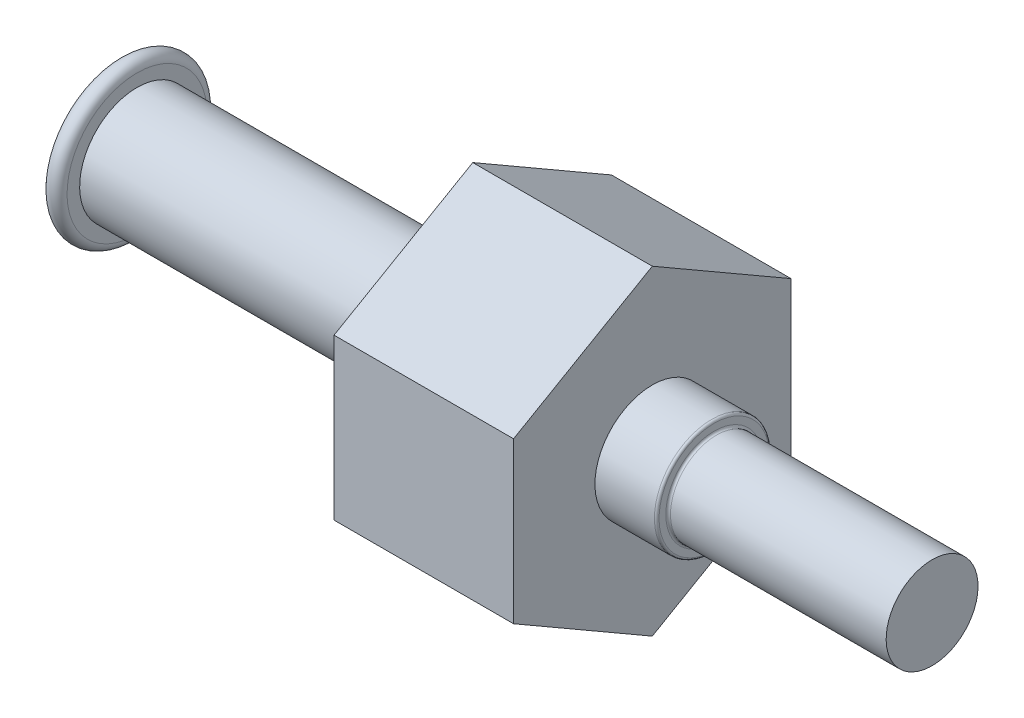
ISO-10303-21;
HEADER;
FILE_DESCRIPTION(('STEP AP214'),'2;1');
FILE_NAME('part.step','',(''),(''),'','','');
FILE_SCHEMA(('AUTOMOTIVE_DESIGN { 1 0 10303 214 1 1 1 1 }'));
ENDSEC;
DATA;
#1=APPLICATION_CONTEXT('core data for automotive mechanical design processes');
#2=APPLICATION_PROTOCOL_DEFINITION('international standard','automotive_design',2000,#1);
#3=PRODUCT_CONTEXT('',#1,'mechanical');
#4=PRODUCT('Part','Part','',(#3));
#5=PRODUCT_RELATED_PRODUCT_CATEGORY('part','',(#4));
#6=PRODUCT_DEFINITION_FORMATION('','',#4);
#7=PRODUCT_DEFINITION_CONTEXT('part definition',#1,'design');
#8=PRODUCT_DEFINITION('design','',#6,#7);
#9=PRODUCT_DEFINITION_SHAPE('','',#8);
#10=(LENGTH_UNIT() NAMED_UNIT(*) SI_UNIT(.MILLI.,.METRE.));
#11=(NAMED_UNIT(*) PLANE_ANGLE_UNIT() SI_UNIT($,.RADIAN.));
#12=(NAMED_UNIT(*) SI_UNIT($,.STERADIAN.) SOLID_ANGLE_UNIT());
#13=UNCERTAINTY_MEASURE_WITH_UNIT(LENGTH_MEASURE(1.E-05),#10,'distance_accuracy_value','');
#14=(GEOMETRIC_REPRESENTATION_CONTEXT(3) GLOBAL_UNCERTAINTY_ASSIGNED_CONTEXT((#13)) GLOBAL_UNIT_ASSIGNED_CONTEXT((#10,
#11,#12)) REPRESENTATION_CONTEXT('',''));
#15=CARTESIAN_POINT('',(0.,0.,0.));
#16=DIRECTION('',(0.,0.,1.));
#17=DIRECTION('',(1.,0.,0.));
#18=AXIS2_PLACEMENT_3D('',#15,#16,#17);
#19=CARTESIAN_POINT('',(34.1,0.,0.));
#20=DIRECTION('',(1.,0.,0.));
#21=DIRECTION('',(0.,1.,0.));
#22=AXIS2_PLACEMENT_3D('',#19,#20,#21);
#23=CYLINDRICAL_SURFACE('',#22,2.46);
#24=CARTESIAN_POINT('',(22.1,0.,0.));
#25=DIRECTION('',(1.,0.,0.));
#26=DIRECTION('',(0.,0.,-1.));
#27=AXIS2_PLACEMENT_3D('',#24,#25,#26);
#28=CIRCLE('',#27,2.46);
#29=CARTESIAN_POINT('',(22.1,0.,-2.46));
#30=VERTEX_POINT('',#29);
#31=EDGE_CURVE('E11',#30,#30,#28,.F.);
#32=ORIENTED_EDGE('',*,*,#31,.F.);
#33=EDGE_LOOP('',(#32));
#34=FACE_BOUND('',#33,.T.);
#35=CARTESIAN_POINT('',(24.65,0.,0.));
#36=DIRECTION('',(1.,0.,0.));
#37=DIRECTION('',(0.,1.,0.));
#38=AXIS2_PLACEMENT_3D('',#35,#36,#37);
#39=CIRCLE('',#38,2.46);
#40=CARTESIAN_POINT('',(24.65,2.46,0.));
#41=VERTEX_POINT('',#40);
#42=EDGE_CURVE('E49',#41,#41,#39,.T.);
#43=ORIENTED_EDGE('',*,*,#42,.F.);
#44=EDGE_LOOP('',(#43));
#45=FACE_BOUND('',#44,.T.);
#46=ADVANCED_FACE('F39',(#34,#45),#23,.T.);
#47=CARTESIAN_POINT('',(24.65,0.,0.));
#48=DIRECTION('',(1.,0.,0.));
#49=DIRECTION('',(0.,1.,0.));
#50=AXIS2_PLACEMENT_3D('',#47,#48,#49);
#51=TOROIDAL_SURFACE('',#50,2.36,0.0999999999999996);
#52=ORIENTED_EDGE('',*,*,#42,.T.);
#53=EDGE_LOOP('',(#52));
#54=FACE_BOUND('',#53,.T.);
#55=CARTESIAN_POINT('',(24.75,0.,0.));
#56=DIRECTION('',(1.,0.,0.));
#57=DIRECTION('',(0.,1.,0.));
#58=AXIS2_PLACEMENT_3D('',#55,#56,#57);
#59=CIRCLE('',#58,2.36);
#60=CARTESIAN_POINT('',(24.75,2.36,0.));
#61=VERTEX_POINT('',#60);
#62=EDGE_CURVE('E190',#61,#61,#59,.T.);
#63=ORIENTED_EDGE('',*,*,#62,.F.);
#64=EDGE_LOOP('',(#63));
#65=FACE_BOUND('',#64,.T.);
#66=ADVANCED_FACE('F198',(#54,#65),#51,.T.);
#67=CARTESIAN_POINT('',(24.75,2.36,0.));
#68=DIRECTION('',(1.,0.,0.));
#69=DIRECTION('',(0.,1.,0.));
#70=AXIS2_PLACEMENT_3D('',#67,#68,#69);
#71=PLANE('',#70);
#72=ORIENTED_EDGE('',*,*,#62,.T.);
#73=EDGE_LOOP('',(#72));
#74=FACE_BOUND('',#73,.T.);
#75=CARTESIAN_POINT('',(24.75,0.,0.));
#76=DIRECTION('',(1.,0.,0.));
#77=DIRECTION('',(0.,1.,0.));
#78=AXIS2_PLACEMENT_3D('',#75,#76,#77);
#79=CIRCLE('',#78,2.07);
#80=CARTESIAN_POINT('',(24.75,2.07,0.));
#81=VERTEX_POINT('',#80);
#82=EDGE_CURVE('E186',#81,#81,#79,.T.);
#83=ORIENTED_EDGE('',*,*,#82,.F.);
#84=EDGE_LOOP('',(#83));
#85=FACE_BOUND('',#84,.T.);
#86=ADVANCED_FACE('F207',(#74,#85),#71,.T.);
#87=CARTESIAN_POINT('',(24.85,0.,0.));
#88=DIRECTION('',(1.,0.,0.));
#89=DIRECTION('',(0.,1.,0.));
#90=AXIS2_PLACEMENT_3D('',#87,#88,#89);
#91=TOROIDAL_SURFACE('',#90,2.07,0.0999999999999996);
#92=ORIENTED_EDGE('',*,*,#82,.T.);
#93=EDGE_LOOP('',(#92));
#94=FACE_BOUND('',#93,.T.);
#95=CARTESIAN_POINT('',(24.85,0.,0.));
#96=DIRECTION('',(1.,0.,0.));
#97=DIRECTION('',(0.,1.,0.));
#98=AXIS2_PLACEMENT_3D('',#95,#96,#97);
#99=CIRCLE('',#98,1.97);
#100=CARTESIAN_POINT('',(24.85,1.97,0.));
#101=VERTEX_POINT('',#100);
#102=EDGE_CURVE('E182',#101,#101,#99,.T.);
#103=ORIENTED_EDGE('',*,*,#102,.F.);
#104=EDGE_LOOP('',(#103));
#105=FACE_BOUND('',#104,.T.);
#106=ADVANCED_FACE('F264',(#94,#105),#91,.F.);
#107=CARTESIAN_POINT('',(34.1,0.,0.));
#108=DIRECTION('',(1.,0.,0.));
#109=DIRECTION('',(0.,1.,0.));
#110=AXIS2_PLACEMENT_3D('',#107,#108,#109);
#111=CYLINDRICAL_SURFACE('',#110,1.97);
#112=ORIENTED_EDGE('',*,*,#102,.T.);
#113=EDGE_LOOP('',(#112));
#114=FACE_BOUND('',#113,.T.);
#115=CARTESIAN_POINT('',(34.1,0.,0.));
#116=DIRECTION('',(1.,0.,0.));
#117=DIRECTION('',(0.,1.,0.));
#118=AXIS2_PLACEMENT_3D('',#115,#116,#117);
#119=CIRCLE('',#118,1.97);
#120=CARTESIAN_POINT('',(34.1,1.97,0.));
#121=VERTEX_POINT('',#120);
#122=EDGE_CURVE('E178',#121,#121,#119,.T.);
#123=ORIENTED_EDGE('',*,*,#122,.F.);
#124=EDGE_LOOP('',(#123));
#125=FACE_BOUND('',#124,.T.);
#126=ADVANCED_FACE('F260',(#114,#125),#111,.T.);
#127=CARTESIAN_POINT('',(34.1,1.97,0.));
#128=DIRECTION('',(1.,0.,0.));
#129=DIRECTION('',(0.,1.,0.));
#130=AXIS2_PLACEMENT_3D('',#127,#128,#129);
#131=PLANE('',#130);
#132=ORIENTED_EDGE('',*,*,#122,.T.);
#133=EDGE_LOOP('',(#132));
#134=FACE_BOUND('',#133,.T.);
#135=ADVANCED_FACE('F250',(#134),#131,.T.);
#136=CARTESIAN_POINT('',(14.4,6.87046820335655,0.));
#137=DIRECTION('',(0.,0.866025403784439,0.5));
#138=DIRECTION('',(0.,-0.5,0.866025403784439));
#139=AXIS2_PLACEMENT_3D('',#136,#137,#138);
#140=PLANE('',#139);
#141=DIRECTION('',(0.,-0.5,0.866025403784438));
#142=VECTOR('',#141,1.);
#143=CARTESIAN_POINT('',(22.1,6.87046820335655,0.));
#144=LINE('',#143,#142);
#145=CARTESIAN_POINT('',(22.1,6.87046820335655,0.));
#146=VERTEX_POINT('',#145);
#147=CARTESIAN_POINT('',(22.1,3.43523410167827,5.95));
#148=VERTEX_POINT('',#147);
#149=EDGE_CURVE('E133',#146,#148,#144,.T.);
#150=ORIENTED_EDGE('',*,*,#149,.F.);
#151=DIRECTION('',(1.,0.,0.));
#152=VECTOR('',#151,1.);
#153=CARTESIAN_POINT('',(14.4,6.87046820335655,0.));
#154=LINE('',#153,#152);
#155=CARTESIAN_POINT('',(14.4,6.87046820335655,0.));
#156=VERTEX_POINT('',#155);
#157=EDGE_CURVE('E57',#156,#146,#154,.T.);
#158=ORIENTED_EDGE('',*,*,#157,.F.);
#159=DIRECTION('',(0.,-0.5,0.866025403784438));
#160=VECTOR('',#159,1.);
#161=CARTESIAN_POINT('',(14.4,6.87046820335655,0.));
#162=LINE('',#161,#160);
#163=CARTESIAN_POINT('',(14.4,3.43523410167827,5.95));
#164=VERTEX_POINT('',#163);
#165=EDGE_CURVE('E154',#156,#164,#162,.T.);
#166=ORIENTED_EDGE('',*,*,#165,.T.);
#167=DIRECTION('',(1.,0.,0.));
#168=VECTOR('',#167,1.);
#169=CARTESIAN_POINT('',(14.4,3.43523410167827,5.95));
#170=LINE('',#169,#168);
#171=EDGE_CURVE('E92',#164,#148,#170,.T.);
#172=ORIENTED_EDGE('',*,*,#171,.T.);
#173=EDGE_LOOP('',(#150,#158,#166,#172));
#174=FACE_BOUND('',#173,.T.);
#175=ADVANCED_FACE('F241',(#174),#140,.T.);
#176=CARTESIAN_POINT('',(14.4,3.43523410167827,-5.95));
#177=DIRECTION('',(0.,0.866025403784438,-0.5));
#178=DIRECTION('',(0.,0.5,0.866025403784439));
#179=AXIS2_PLACEMENT_3D('',#176,#177,#178);
#180=PLANE('',#179);
#181=DIRECTION('',(0.,0.5,0.866025403784438));
#182=VECTOR('',#181,1.);
#183=CARTESIAN_POINT('',(22.1,3.43523410167827,-5.95));
#184=LINE('',#183,#182);
#185=CARTESIAN_POINT('',(22.1,3.43523410167827,-5.95));
#186=VERTEX_POINT('',#185);
#187=EDGE_CURVE('E150',#186,#146,#184,.T.);
#188=ORIENTED_EDGE('',*,*,#187,.F.);
#189=DIRECTION('',(1.,0.,0.));
#190=VECTOR('',#189,1.);
#191=CARTESIAN_POINT('',(14.4,3.43523410167827,-5.95));
#192=LINE('',#191,#190);
#193=CARTESIAN_POINT('',(14.4,3.43523410167827,-5.95));
#194=VERTEX_POINT('',#193);
#195=EDGE_CURVE('E80',#194,#186,#192,.T.);
#196=ORIENTED_EDGE('',*,*,#195,.F.);
#197=DIRECTION('',(0.,0.5,0.866025403784438));
#198=VECTOR('',#197,1.);
#199=CARTESIAN_POINT('',(14.4,3.43523410167827,-5.95));
#200=LINE('',#199,#198);
#201=EDGE_CURVE('E119',#194,#156,#200,.T.);
#202=ORIENTED_EDGE('',*,*,#201,.T.);
#203=ORIENTED_EDGE('',*,*,#157,.T.);
#204=EDGE_LOOP('',(#188,#196,#202,#203));
#205=FACE_BOUND('',#204,.T.);
#206=ADVANCED_FACE('F238',(#205),#180,.T.);
#207=CARTESIAN_POINT('',(14.4,-3.43523410167827,-5.95));
#208=DIRECTION('',(0.,0.,-1.));
#209=DIRECTION('',(0.,1.,0.));
#210=AXIS2_PLACEMENT_3D('',#207,#208,#209);
#211=PLANE('',#210);
#212=DIRECTION('',(0.,1.,0.));
#213=VECTOR('',#212,1.);
#214=CARTESIAN_POINT('',(22.1,-3.43523410167827,-5.95));
#215=LINE('',#214,#213);
#216=CARTESIAN_POINT('',(22.1,-3.43523410167827,-5.95));
#217=VERTEX_POINT('',#216);
#218=EDGE_CURVE('E105',#217,#186,#215,.T.);
#219=ORIENTED_EDGE('',*,*,#218,.F.);
#220=DIRECTION('',(1.,0.,0.));
#221=VECTOR('',#220,1.);
#222=CARTESIAN_POINT('',(14.4,-3.43523410167827,-5.95));
#223=LINE('',#222,#221);
#224=CARTESIAN_POINT('',(14.4,-3.43523410167827,-5.95));
#225=VERTEX_POINT('',#224);
#226=EDGE_CURVE('E100',#225,#217,#223,.T.);
#227=ORIENTED_EDGE('',*,*,#226,.F.);
#228=DIRECTION('',(0.,1.,0.));
#229=VECTOR('',#228,1.);
#230=CARTESIAN_POINT('',(14.4,-3.43523410167827,-5.95));
#231=LINE('',#230,#229);
#232=EDGE_CURVE('E103',#225,#194,#231,.T.);
#233=ORIENTED_EDGE('',*,*,#232,.T.);
#234=ORIENTED_EDGE('',*,*,#195,.T.);
#235=EDGE_LOOP('',(#219,#227,#233,#234));
#236=FACE_BOUND('',#235,.T.);
#237=ADVANCED_FACE('F102',(#236),#211,.T.);
#238=CARTESIAN_POINT('',(14.4,-6.87046820335655,0.));
#239=DIRECTION('',(0.,-0.866025403784438,-0.5));
#240=DIRECTION('',(0.,0.5,-0.866025403784439));
#241=AXIS2_PLACEMENT_3D('',#238,#239,#240);
#242=PLANE('',#241);
#243=DIRECTION('',(0.,0.5,-0.866025403784438));
#244=VECTOR('',#243,1.);
#245=CARTESIAN_POINT('',(22.1,-6.87046820335655,0.));
#246=LINE('',#245,#244);
#247=CARTESIAN_POINT('',(22.1,-6.87046820335655,0.));
#248=VERTEX_POINT('',#247);
#249=EDGE_CURVE('E145',#248,#217,#246,.T.);
#250=ORIENTED_EDGE('',*,*,#249,.F.);
#251=DIRECTION('',(1.,0.,0.));
#252=VECTOR('',#251,1.);
#253=CARTESIAN_POINT('',(14.4,-6.87046820335655,0.));
#254=LINE('',#253,#252);
#255=CARTESIAN_POINT('',(14.4,-6.87046820335655,0.));
#256=VERTEX_POINT('',#255);
#257=EDGE_CURVE('E111',#256,#248,#254,.T.);
#258=ORIENTED_EDGE('',*,*,#257,.F.);
#259=DIRECTION('',(0.,0.5,-0.866025403784438));
#260=VECTOR('',#259,1.);
#261=CARTESIAN_POINT('',(14.4,-6.87046820335655,0.));
#262=LINE('',#261,#260);
#263=EDGE_CURVE('E117',#256,#225,#262,.T.);
#264=ORIENTED_EDGE('',*,*,#263,.T.);
#265=ORIENTED_EDGE('',*,*,#226,.T.);
#266=EDGE_LOOP('',(#250,#258,#264,#265));
#267=FACE_BOUND('',#266,.T.);
#268=ADVANCED_FACE('F122',(#267),#242,.T.);
#269=CARTESIAN_POINT('',(14.4,-3.43523410167827,5.95));
#270=DIRECTION('',(0.,-0.866025403784438,0.5));
#271=DIRECTION('',(0.,-0.5,-0.866025403784439));
#272=AXIS2_PLACEMENT_3D('',#269,#270,#271);
#273=PLANE('',#272);
#274=DIRECTION('',(0.,-0.5,-0.866025403784438));
#275=VECTOR('',#274,1.);
#276=CARTESIAN_POINT('',(22.1,-3.43523410167827,5.95));
#277=LINE('',#276,#275);
#278=CARTESIAN_POINT('',(22.1,-3.43523410167827,5.95));
#279=VERTEX_POINT('',#278);
#280=EDGE_CURVE('E141',#279,#248,#277,.T.);
#281=ORIENTED_EDGE('',*,*,#280,.F.);
#282=DIRECTION('',(1.,0.,0.));
#283=VECTOR('',#282,1.);
#284=CARTESIAN_POINT('',(14.4,-3.43523410167827,5.95));
#285=LINE('',#284,#283);
#286=CARTESIAN_POINT('',(14.4,-3.43523410167827,5.95));
#287=VERTEX_POINT('',#286);
#288=EDGE_CURVE('E161',#287,#279,#285,.T.);
#289=ORIENTED_EDGE('',*,*,#288,.F.);
#290=DIRECTION('',(0.,-0.5,-0.866025403784438));
#291=VECTOR('',#290,1.);
#292=CARTESIAN_POINT('',(14.4,-3.43523410167827,5.95));
#293=LINE('',#292,#291);
#294=EDGE_CURVE('E124',#287,#256,#293,.T.);
#295=ORIENTED_EDGE('',*,*,#294,.T.);
#296=ORIENTED_EDGE('',*,*,#257,.T.);
#297=EDGE_LOOP('',(#281,#289,#295,#296));
#298=FACE_BOUND('',#297,.T.);
#299=ADVANCED_FACE('F235',(#298),#273,.T.);
#300=CARTESIAN_POINT('',(14.4,3.43523410167827,5.95));
#301=DIRECTION('',(0.,0.,1.));
#302=DIRECTION('',(0.,-1.,0.));
#303=AXIS2_PLACEMENT_3D('',#300,#301,#302);
#304=PLANE('',#303);
#305=DIRECTION('',(0.,-1.,0.));
#306=VECTOR('',#305,1.);
#307=CARTESIAN_POINT('',(22.1,3.43523410167827,5.95));
#308=LINE('',#307,#306);
#309=EDGE_CURVE('E137',#148,#279,#308,.T.);
#310=ORIENTED_EDGE('',*,*,#309,.F.);
#311=ORIENTED_EDGE('',*,*,#171,.F.);
#312=DIRECTION('',(0.,-1.,0.));
#313=VECTOR('',#312,1.);
#314=CARTESIAN_POINT('',(14.4,3.43523410167827,5.95));
#315=LINE('',#314,#313);
#316=EDGE_CURVE('E127',#164,#287,#315,.T.);
#317=ORIENTED_EDGE('',*,*,#316,.T.);
#318=ORIENTED_EDGE('',*,*,#288,.T.);
#319=EDGE_LOOP('',(#310,#311,#317,#318));
#320=FACE_BOUND('',#319,.T.);
#321=ADVANCED_FACE('F226',(#320),#304,.T.);
#322=CARTESIAN_POINT('',(14.4,0.,0.));
#323=DIRECTION('',(1.,0.,0.));
#324=DIRECTION('',(0.,0.,-1.));
#325=AXIS2_PLACEMENT_3D('',#322,#323,#324);
#326=PLANE('',#325);
#327=CARTESIAN_POINT('',(14.4,0.,0.));
#328=DIRECTION('',(1.,0.,0.));
#329=DIRECTION('',(0.,0.,-1.));
#330=AXIS2_PLACEMENT_3D('',#327,#328,#329);
#331=CIRCLE('',#330,2.46);
#332=CARTESIAN_POINT('',(14.4,0.,-2.46));
#333=VERTEX_POINT('',#332);
#334=EDGE_CURVE('E42',#333,#333,#331,.F.);
#335=ORIENTED_EDGE('',*,*,#334,.F.);
#336=EDGE_LOOP('',(#335));
#337=FACE_BOUND('',#336,.T.);
#338=ORIENTED_EDGE('',*,*,#165,.F.);
#339=ORIENTED_EDGE('',*,*,#201,.F.);
#340=ORIENTED_EDGE('',*,*,#232,.F.);
#341=ORIENTED_EDGE('',*,*,#263,.F.);
#342=ORIENTED_EDGE('',*,*,#294,.F.);
#343=ORIENTED_EDGE('',*,*,#316,.F.);
#344=EDGE_LOOP('',(#338,#339,#340,#341,#342,#343));
#345=FACE_BOUND('',#344,.T.);
#346=ADVANCED_FACE('F115',(#337,#345),#326,.F.);
#347=CARTESIAN_POINT('',(22.1,0.,0.));
#348=DIRECTION('',(1.,0.,0.));
#349=DIRECTION('',(0.,0.,-1.));
#350=AXIS2_PLACEMENT_3D('',#347,#348,#349);
#351=PLANE('',#350);
#352=ORIENTED_EDGE('',*,*,#31,.T.);
#353=EDGE_LOOP('',(#352));
#354=FACE_BOUND('',#353,.T.);
#355=ORIENTED_EDGE('',*,*,#149,.T.);
#356=ORIENTED_EDGE('',*,*,#309,.T.);
#357=ORIENTED_EDGE('',*,*,#280,.T.);
#358=ORIENTED_EDGE('',*,*,#249,.T.);
#359=ORIENTED_EDGE('',*,*,#218,.T.);
#360=ORIENTED_EDGE('',*,*,#187,.T.);
#361=EDGE_LOOP('',(#355,#356,#357,#358,#359,#360));
#362=FACE_BOUND('',#361,.T.);
#363=ADVANCED_FACE('F225',(#354,#362),#351,.T.);
#364=CARTESIAN_POINT('',(8.37500000000002,0.,0.));
#365=DIRECTION('',(1.,0.,0.));
#366=DIRECTION('',(0.,1.,0.));
#367=AXIS2_PLACEMENT_3D('',#364,#365,#366);
#368=SPHERICAL_SURFACE('',#367,9.62500000000002);
#369=CARTESIAN_POINT('',(-0.729729729729733,0.,0.));
#370=DIRECTION('',(1.,0.,0.));
#371=DIRECTION('',(0.,1.,0.));
#372=AXIS2_PLACEMENT_3D('',#369,#370,#371);
#373=CIRCLE('',#372,3.12162162162163);
#374=CARTESIAN_POINT('',(-0.729729729729734,3.12162162162162,0.));
#375=VERTEX_POINT('',#374);
#376=EDGE_CURVE('E174',#375,#375,#373,.T.);
#377=ORIENTED_EDGE('',*,*,#376,.F.);
#378=EDGE_LOOP('',(#377));
#379=FACE_BOUND('',#378,.T.);
#380=ADVANCED_FACE('F232',(#379),#368,.T.);
#381=CARTESIAN_POINT('',(-0.375,0.,0.));
#382=DIRECTION('',(1.,0.,0.));
#383=DIRECTION('',(0.,1.,0.));
#384=AXIS2_PLACEMENT_3D('',#381,#382,#383);
#385=TOROIDAL_SURFACE('',#384,3.,0.375000000000002);
#386=ORIENTED_EDGE('',*,*,#376,.T.);
#387=EDGE_LOOP('',(#386));
#388=FACE_BOUND('',#387,.T.);
#389=CARTESIAN_POINT('',(0.,0.,0.));
#390=DIRECTION('',(1.,0.,0.));
#391=DIRECTION('',(0.,1.,0.));
#392=AXIS2_PLACEMENT_3D('',#389,#390,#391);
#393=CIRCLE('',#392,3.);
#394=CARTESIAN_POINT('',(0.,3.,0.));
#395=VERTEX_POINT('',#394);
#396=EDGE_CURVE('E170',#395,#395,#393,.T.);
#397=ORIENTED_EDGE('',*,*,#396,.F.);
#398=EDGE_LOOP('',(#397));
#399=FACE_BOUND('',#398,.T.);
#400=ADVANCED_FACE('F215',(#388,#399),#385,.T.);
#401=CARTESIAN_POINT('',(0.,2.46,0.));
#402=DIRECTION('',(1.,0.,0.));
#403=DIRECTION('',(0.,1.,0.));
#404=AXIS2_PLACEMENT_3D('',#401,#402,#403);
#405=PLANE('',#404);
#406=ORIENTED_EDGE('',*,*,#396,.T.);
#407=EDGE_LOOP('',(#406));
#408=FACE_BOUND('',#407,.T.);
#409=CARTESIAN_POINT('',(0.,0.,0.));
#410=DIRECTION('',(1.,0.,0.));
#411=DIRECTION('',(0.,1.,0.));
#412=AXIS2_PLACEMENT_3D('',#409,#410,#411);
#413=CIRCLE('',#412,2.46);
#414=CARTESIAN_POINT('',(0.,2.46,0.));
#415=VERTEX_POINT('',#414);
#416=EDGE_CURVE('E166',#415,#415,#413,.T.);
#417=ORIENTED_EDGE('',*,*,#416,.F.);
#418=EDGE_LOOP('',(#417));
#419=FACE_BOUND('',#418,.T.);
#420=ADVANCED_FACE('F210',(#408,#419),#405,.T.);
#421=ORIENTED_EDGE('',*,*,#416,.T.);
#422=EDGE_LOOP('',(#421));
#423=FACE_BOUND('',#422,.T.);
#424=ORIENTED_EDGE('',*,*,#334,.T.);
#425=EDGE_LOOP('',(#424));
#426=FACE_BOUND('',#425,.T.);
#427=ADVANCED_FACE('F203',(#423,#426),#23,.T.);
#428=CLOSED_SHELL('',(#46,#66,#86,#106,#126,#135,#175,#206,#237,#268,#299,#321,#346,#363,#380,
#400,#420,#427));
#429=MANIFOLD_SOLID_BREP('B2',#428);
#430=ADVANCED_BREP_SHAPE_REPRESENTATION('',(#18,#429),#14);
#431=SHAPE_DEFINITION_REPRESENTATION(#9,#430);
ENDSEC;
END-ISO-10303-21;
